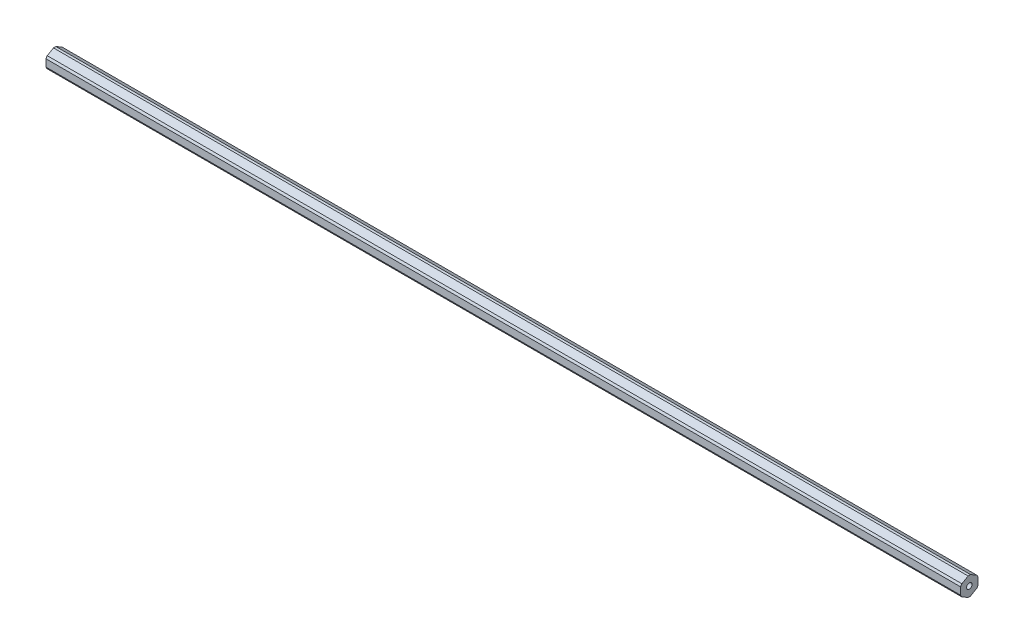
ISO-10303-21;
HEADER;
FILE_DESCRIPTION(('STEP AP214'),'2;1');
FILE_NAME('part.step','',(''),(''),'','','');
FILE_SCHEMA(('AUTOMOTIVE_DESIGN { 1 0 10303 214 1 1 1 1 }'));
ENDSEC;
DATA;
#1=APPLICATION_CONTEXT('core data for automotive mechanical design processes');
#2=APPLICATION_PROTOCOL_DEFINITION('international standard','automotive_design',2000,#1);
#3=PRODUCT_CONTEXT('',#1,'mechanical');
#4=PRODUCT('Part','Part','',(#3));
#5=PRODUCT_RELATED_PRODUCT_CATEGORY('part','',(#4));
#6=PRODUCT_DEFINITION_FORMATION('','',#4);
#7=PRODUCT_DEFINITION_CONTEXT('part definition',#1,'design');
#8=PRODUCT_DEFINITION('design','',#6,#7);
#9=PRODUCT_DEFINITION_SHAPE('','',#8);
#10=(LENGTH_UNIT() NAMED_UNIT(*) SI_UNIT(.MILLI.,.METRE.));
#11=(NAMED_UNIT(*) PLANE_ANGLE_UNIT() SI_UNIT($,.RADIAN.));
#12=(NAMED_UNIT(*) SI_UNIT($,.STERADIAN.) SOLID_ANGLE_UNIT());
#13=UNCERTAINTY_MEASURE_WITH_UNIT(LENGTH_MEASURE(1.E-05),#10,'distance_accuracy_value','');
#14=(GEOMETRIC_REPRESENTATION_CONTEXT(3) GLOBAL_UNCERTAINTY_ASSIGNED_CONTEXT((#13)) GLOBAL_UNIT_ASSIGNED_CONTEXT((#10,
#11,#12)) REPRESENTATION_CONTEXT('',''));
#15=CARTESIAN_POINT('',(0.,0.,0.));
#16=DIRECTION('',(0.,0.,1.));
#17=DIRECTION('',(1.,0.,0.));
#18=AXIS2_PLACEMENT_3D('',#15,#16,#17);
#19=CARTESIAN_POINT('',(328.6125,284.899735,498.475273482724));
#20=DIRECTION('',(0.,-0.866025403784436,-0.5));
#21=DIRECTION('',(0.,0.5,-0.866025403784436));
#22=AXIS2_PLACEMENT_3D('',#19,#20,#21);
#23=PLANE('',#22);
#24=DIRECTION('',(-1.,0.,0.));
#25=VECTOR('',#24,1.);
#26=CARTESIAN_POINT('',(328.6125,286.216566257194,496.194454840268));
#27=LINE('',#26,#25);
#28=CARTESIAN_POINT('',(328.6125,286.216566257194,496.194454840268));
#29=VERTEX_POINT('',#28);
#30=CARTESIAN_POINT('',(-341.3125,286.216566257194,496.194454840268));
#31=VERTEX_POINT('',#30);
#32=EDGE_CURVE('E182',#29,#31,#27,.T.);
#33=ORIENTED_EDGE('',*,*,#32,.T.);
#34=DIRECTION('',(0.,0.5,-0.866025403784436));
#35=VECTOR('',#34,1.);
#36=CARTESIAN_POINT('',(-341.3125,284.899735,498.475273482724));
#37=LINE('',#36,#35);
#38=CARTESIAN_POINT('',(-341.3125,283.582903742805,500.75609212518));
#39=VERTEX_POINT('',#38);
#40=EDGE_CURVE('E143',#39,#31,#37,.T.);
#41=ORIENTED_EDGE('',*,*,#40,.F.);
#42=DIRECTION('',(-1.,0.,0.));
#43=VECTOR('',#42,1.);
#44=CARTESIAN_POINT('',(328.6125,283.582903742805,500.75609212518));
#45=LINE('',#44,#43);
#46=CARTESIAN_POINT('',(328.6125,283.582903742805,500.75609212518));
#47=VERTEX_POINT('',#46);
#48=EDGE_CURVE('E185',#39,#47,#45,.F.);
#49=ORIENTED_EDGE('',*,*,#48,.T.);
#50=DIRECTION('',(0.,-0.5,0.866025403784436));
#51=VECTOR('',#50,1.);
#52=CARTESIAN_POINT('',(328.6125,284.899735,498.475273482724));
#53=LINE('',#52,#51);
#54=EDGE_CURVE('E193',#29,#47,#53,.T.);
#55=ORIENTED_EDGE('',*,*,#54,.F.);
#56=EDGE_LOOP('',(#33,#41,#49,#55));
#57=FACE_BOUND('',#56,.T.);
#58=ADVANCED_FACE('F17',(#57),#23,.F.);
#59=CARTESIAN_POINT('',(328.6125,279.4,501.650546965445));
#60=DIRECTION('',(0.,0.,-1.));
#61=DIRECTION('',(-1.,0.,0.));
#62=AXIS2_PLACEMENT_3D('',#59,#60,#61);
#63=PLANE('',#62);
#64=DIRECTION('',(-1.,0.,0.));
#65=VECTOR('',#64,1.);
#66=CARTESIAN_POINT('',(328.6125,282.03366251439,501.650546965445));
#67=LINE('',#66,#65);
#68=CARTESIAN_POINT('',(328.6125,282.03366251439,501.650546965445));
#69=VERTEX_POINT('',#68);
#70=CARTESIAN_POINT('',(-341.3125,282.03366251439,501.650546965445));
#71=VERTEX_POINT('',#70);
#72=EDGE_CURVE('E118',#69,#71,#67,.T.);
#73=ORIENTED_EDGE('',*,*,#72,.T.);
#74=DIRECTION('',(0.,1.,0.));
#75=VECTOR('',#74,1.);
#76=CARTESIAN_POINT('',(-341.3125,279.4,501.650546965445));
#77=LINE('',#76,#75);
#78=CARTESIAN_POINT('',(-341.3125,276.76633748561,501.650546965445));
#79=VERTEX_POINT('',#78);
#80=EDGE_CURVE('E136',#79,#71,#77,.T.);
#81=ORIENTED_EDGE('',*,*,#80,.F.);
#82=DIRECTION('',(-1.,0.,0.));
#83=VECTOR('',#82,1.);
#84=CARTESIAN_POINT('',(328.6125,276.76633748561,501.650546965445));
#85=LINE('',#84,#83);
#86=CARTESIAN_POINT('',(328.6125,276.76633748561,501.650546965445));
#87=VERTEX_POINT('',#86);
#88=EDGE_CURVE('E178',#79,#87,#85,.F.);
#89=ORIENTED_EDGE('',*,*,#88,.T.);
#90=DIRECTION('',(0.,-1.,0.));
#91=VECTOR('',#90,1.);
#92=CARTESIAN_POINT('',(328.6125,279.4,501.650546965445));
#93=LINE('',#92,#91);
#94=EDGE_CURVE('E197',#69,#87,#93,.T.);
#95=ORIENTED_EDGE('',*,*,#94,.F.);
#96=EDGE_LOOP('',(#73,#81,#89,#95));
#97=FACE_BOUND('',#96,.T.);
#98=ADVANCED_FACE('F257',(#97),#63,.F.);
#99=CARTESIAN_POINT('',(328.6125,273.900265,498.475273482724));
#100=DIRECTION('',(0.,0.86602540378444,-0.5));
#101=DIRECTION('',(0.,0.5,0.86602540378444));
#102=AXIS2_PLACEMENT_3D('',#99,#100,#101);
#103=PLANE('',#102);
#104=DIRECTION('',(-1.,0.,0.));
#105=VECTOR('',#104,1.);
#106=CARTESIAN_POINT('',(328.6125,275.217096257194,500.75609212518));
#107=LINE('',#106,#105);
#108=CARTESIAN_POINT('',(328.6125,275.217096257194,500.75609212518));
#109=VERTEX_POINT('',#108);
#110=CARTESIAN_POINT('',(-341.3125,275.217096257194,500.75609212518));
#111=VERTEX_POINT('',#110);
#112=EDGE_CURVE('E119',#109,#111,#107,.T.);
#113=ORIENTED_EDGE('',*,*,#112,.T.);
#114=DIRECTION('',(0.,0.5,0.86602540378444));
#115=VECTOR('',#114,1.);
#116=CARTESIAN_POINT('',(-341.3125,273.900265,498.475273482724));
#117=LINE('',#116,#115);
#118=CARTESIAN_POINT('',(-341.3125,272.583433742805,496.194454840267));
#119=VERTEX_POINT('',#118);
#120=EDGE_CURVE('E125',#119,#111,#117,.T.);
#121=ORIENTED_EDGE('',*,*,#120,.F.);
#122=DIRECTION('',(-1.,0.,0.));
#123=VECTOR('',#122,1.);
#124=CARTESIAN_POINT('',(328.6125,272.583433742805,496.194454840267));
#125=LINE('',#124,#123);
#126=CARTESIAN_POINT('',(328.6125,272.583433742805,496.194454840267));
#127=VERTEX_POINT('',#126);
#128=EDGE_CURVE('E106',#119,#127,#125,.F.);
#129=ORIENTED_EDGE('',*,*,#128,.T.);
#130=DIRECTION('',(0.,-0.5,-0.86602540378444));
#131=VECTOR('',#130,1.);
#132=CARTESIAN_POINT('',(328.6125,273.900265,498.475273482724));
#133=LINE('',#132,#131);
#134=EDGE_CURVE('E201',#109,#127,#133,.T.);
#135=ORIENTED_EDGE('',*,*,#134,.F.);
#136=EDGE_LOOP('',(#113,#121,#129,#135));
#137=FACE_BOUND('',#136,.T.);
#138=ADVANCED_FACE('F133',(#137),#103,.F.);
#139=CARTESIAN_POINT('',(328.6125,273.900265,492.12472651728));
#140=DIRECTION('',(0.,0.866025403784438,0.5));
#141=DIRECTION('',(0.,-0.5,0.866025403784438));
#142=AXIS2_PLACEMENT_3D('',#139,#140,#141);
#143=PLANE('',#142);
#144=DIRECTION('',(-1.,0.,0.));
#145=VECTOR('',#144,1.);
#146=CARTESIAN_POINT('',(328.6125,272.583433742805,494.405545159736));
#147=LINE('',#146,#145);
#148=CARTESIAN_POINT('',(328.6125,272.583433742805,494.405545159736));
#149=VERTEX_POINT('',#148);
#150=CARTESIAN_POINT('',(-341.3125,272.583433742805,494.405545159736));
#151=VERTEX_POINT('',#150);
#152=EDGE_CURVE('E169',#149,#151,#147,.T.);
#153=ORIENTED_EDGE('',*,*,#152,.T.);
#154=DIRECTION('',(0.,-0.5,0.866025403784438));
#155=VECTOR('',#154,1.);
#156=CARTESIAN_POINT('',(-341.3125,273.900265,492.12472651728));
#157=LINE('',#156,#155);
#158=CARTESIAN_POINT('',(-341.3125,275.217096257194,489.843907874824));
#159=VERTEX_POINT('',#158);
#160=EDGE_CURVE('E128',#159,#151,#157,.T.);
#161=ORIENTED_EDGE('',*,*,#160,.F.);
#162=DIRECTION('',(-1.,0.,0.));
#163=VECTOR('',#162,1.);
#164=CARTESIAN_POINT('',(328.6125,275.217096257194,489.843907874824));
#165=LINE('',#164,#163);
#166=CARTESIAN_POINT('',(328.6125,275.217096257194,489.843907874824));
#167=VERTEX_POINT('',#166);
#168=EDGE_CURVE('E171',#159,#167,#165,.F.);
#169=ORIENTED_EDGE('',*,*,#168,.T.);
#170=DIRECTION('',(0.,0.5,-0.866025403784438));
#171=VECTOR('',#170,1.);
#172=CARTESIAN_POINT('',(328.6125,273.900265,492.12472651728));
#173=LINE('',#172,#171);
#174=EDGE_CURVE('E204',#149,#167,#173,.T.);
#175=ORIENTED_EDGE('',*,*,#174,.F.);
#176=EDGE_LOOP('',(#153,#161,#169,#175));
#177=FACE_BOUND('',#176,.T.);
#178=ADVANCED_FACE('F287',(#177),#143,.F.);
#179=CARTESIAN_POINT('',(328.6125,279.4,488.949453034559));
#180=DIRECTION('',(0.,0.,1.));
#181=DIRECTION('',(1.,0.,0.));
#182=AXIS2_PLACEMENT_3D('',#179,#180,#181);
#183=PLANE('',#182);
#184=DIRECTION('',(-1.,0.,0.));
#185=VECTOR('',#184,1.);
#186=CARTESIAN_POINT('',(328.6125,276.76633748561,488.949453034559));
#187=LINE('',#186,#185);
#188=CARTESIAN_POINT('',(328.6125,276.76633748561,488.949453034559));
#189=VERTEX_POINT('',#188);
#190=CARTESIAN_POINT('',(-341.3125,276.76633748561,488.949453034559));
#191=VERTEX_POINT('',#190);
#192=EDGE_CURVE('E162',#189,#191,#187,.T.);
#193=ORIENTED_EDGE('',*,*,#192,.T.);
#194=DIRECTION('',(0.,-1.,0.));
#195=VECTOR('',#194,1.);
#196=CARTESIAN_POINT('',(-341.3125,279.4,488.949453034559));
#197=LINE('',#196,#195);
#198=CARTESIAN_POINT('',(-341.3125,282.03366251439,488.949453034559));
#199=VERTEX_POINT('',#198);
#200=EDGE_CURVE('E146',#199,#191,#197,.T.);
#201=ORIENTED_EDGE('',*,*,#200,.F.);
#202=DIRECTION('',(-1.,0.,0.));
#203=VECTOR('',#202,1.);
#204=CARTESIAN_POINT('',(328.6125,282.033662514389,488.949453034559));
#205=LINE('',#204,#203);
#206=CARTESIAN_POINT('',(328.6125,282.033662514389,488.949453034559));
#207=VERTEX_POINT('',#206);
#208=EDGE_CURVE('E165',#199,#207,#205,.F.);
#209=ORIENTED_EDGE('',*,*,#208,.T.);
#210=DIRECTION('',(0.,1.,0.));
#211=VECTOR('',#210,1.);
#212=CARTESIAN_POINT('',(328.6125,279.4,488.949453034559));
#213=LINE('',#212,#211);
#214=EDGE_CURVE('E25',#189,#207,#213,.T.);
#215=ORIENTED_EDGE('',*,*,#214,.F.);
#216=EDGE_LOOP('',(#193,#201,#209,#215));
#217=FACE_BOUND('',#216,.T.);
#218=ADVANCED_FACE('F217',(#217),#183,.F.);
#219=CARTESIAN_POINT('',(328.6125,284.899735,492.12472651728));
#220=DIRECTION('',(0.,-0.866025403784438,0.5));
#221=DIRECTION('',(0.,-0.5,-0.866025403784438));
#222=AXIS2_PLACEMENT_3D('',#219,#220,#221);
#223=PLANE('',#222);
#224=DIRECTION('',(-1.,0.,0.));
#225=VECTOR('',#224,1.);
#226=CARTESIAN_POINT('',(328.6125,283.582903742805,489.843907874824));
#227=LINE('',#226,#225);
#228=CARTESIAN_POINT('',(328.6125,283.582903742805,489.843907874824));
#229=VERTEX_POINT('',#228);
#230=CARTESIAN_POINT('',(-341.3125,283.582903742805,489.843907874824));
#231=VERTEX_POINT('',#230);
#232=EDGE_CURVE('E40',#229,#231,#227,.T.);
#233=ORIENTED_EDGE('',*,*,#232,.T.);
#234=DIRECTION('',(0.,-0.5,-0.866025403784438));
#235=VECTOR('',#234,1.);
#236=CARTESIAN_POINT('',(-341.3125,284.899735,492.12472651728));
#237=LINE('',#236,#235);
#238=CARTESIAN_POINT('',(-341.3125,286.216566257194,494.405545159736));
#239=VERTEX_POINT('',#238);
#240=EDGE_CURVE('E227',#239,#231,#237,.T.);
#241=ORIENTED_EDGE('',*,*,#240,.F.);
#242=DIRECTION('',(-1.,0.,0.));
#243=VECTOR('',#242,1.);
#244=CARTESIAN_POINT('',(328.6125,286.216566257194,494.405545159736));
#245=LINE('',#244,#243);
#246=CARTESIAN_POINT('',(328.6125,286.216566257194,494.405545159736));
#247=VERTEX_POINT('',#246);
#248=EDGE_CURVE('E159',#239,#247,#245,.F.);
#249=ORIENTED_EDGE('',*,*,#248,.T.);
#250=DIRECTION('',(0.,0.5,0.866025403784438));
#251=VECTOR('',#250,1.);
#252=CARTESIAN_POINT('',(328.6125,284.899735,492.12472651728));
#253=LINE('',#252,#251);
#254=EDGE_CURVE('E11',#229,#247,#253,.T.);
#255=ORIENTED_EDGE('',*,*,#254,.F.);
#256=EDGE_LOOP('',(#233,#241,#249,#255));
#257=FACE_BOUND('',#256,.T.);
#258=ADVANCED_FACE('F267',(#257),#223,.F.);
#259=CARTESIAN_POINT('',(328.6125,279.4,495.3));
#260=DIRECTION('',(1.,0.,0.));
#261=DIRECTION('',(0.,1.,0.));
#262=AXIS2_PLACEMENT_3D('',#259,#260,#261);
#263=PLANE('',#262);
#264=CARTESIAN_POINT('',(328.6125,279.4,495.3));
#265=DIRECTION('',(1.,0.,0.));
#266=DIRECTION('',(0.,1.,0.));
#267=AXIS2_PLACEMENT_3D('',#264,#265,#266);
#268=CIRCLE('',#267,2.);
#269=CARTESIAN_POINT('',(328.6125,281.4,495.3));
#270=VERTEX_POINT('',#269);
#271=EDGE_CURVE('E189',#270,#270,#268,.T.);
#272=ORIENTED_EDGE('',*,*,#271,.F.);
#273=EDGE_LOOP('',(#272));
#274=FACE_BOUND('',#273,.T.);
#275=ORIENTED_EDGE('',*,*,#54,.T.);
#276=CARTESIAN_POINT('',(328.6125,279.4,495.3));
#277=DIRECTION('',(1.,0.,0.));
#278=DIRECTION('',(0.,1.,0.));
#279=AXIS2_PLACEMENT_3D('',#276,#277,#278);
#280=CIRCLE('',#279,6.875);
#281=EDGE_CURVE('E156',#47,#69,#280,.T.);
#282=ORIENTED_EDGE('',*,*,#281,.T.);
#283=ORIENTED_EDGE('',*,*,#94,.T.);
#284=EDGE_CURVE('E245',#87,#109,#280,.T.);
#285=ORIENTED_EDGE('',*,*,#284,.T.);
#286=ORIENTED_EDGE('',*,*,#134,.T.);
#287=EDGE_CURVE('E112',#127,#149,#280,.T.);
#288=ORIENTED_EDGE('',*,*,#287,.T.);
#289=ORIENTED_EDGE('',*,*,#174,.T.);
#290=EDGE_CURVE('E215',#167,#189,#280,.T.);
#291=ORIENTED_EDGE('',*,*,#290,.T.);
#292=ORIENTED_EDGE('',*,*,#214,.T.);
#293=EDGE_CURVE('E155',#207,#229,#280,.T.);
#294=ORIENTED_EDGE('',*,*,#293,.T.);
#295=ORIENTED_EDGE('',*,*,#254,.T.);
#296=EDGE_CURVE('E32',#247,#29,#280,.T.);
#297=ORIENTED_EDGE('',*,*,#296,.T.);
#298=EDGE_LOOP('',(#275,#282,#283,#285,#286,#288,#289,#291,#292,#294,#295,#297));
#299=FACE_BOUND('',#298,.T.);
#300=ADVANCED_FACE('F213',(#274,#299),#263,.T.);
#301=CARTESIAN_POINT('',(328.6125,279.4,495.3));
#302=DIRECTION('',(-1.,0.,0.));
#303=DIRECTION('',(0.,-1.,0.));
#304=AXIS2_PLACEMENT_3D('',#301,#302,#303);
#305=CYLINDRICAL_SURFACE('',#304,2.);
#306=ORIENTED_EDGE('',*,*,#271,.T.);
#307=EDGE_LOOP('',(#306));
#308=FACE_BOUND('',#307,.T.);
#309=CARTESIAN_POINT('',(-341.3125,279.4,495.3));
#310=DIRECTION('',(-1.,0.,0.));
#311=DIRECTION('',(0.,-1.,0.));
#312=AXIS2_PLACEMENT_3D('',#309,#310,#311);
#313=CIRCLE('',#312,2.);
#314=CARTESIAN_POINT('',(-341.3125,277.4,495.3));
#315=VERTEX_POINT('',#314);
#316=EDGE_CURVE('E233',#315,#315,#313,.T.);
#317=ORIENTED_EDGE('',*,*,#316,.T.);
#318=EDGE_LOOP('',(#317));
#319=FACE_BOUND('',#318,.T.);
#320=ADVANCED_FACE('F281',(#308,#319),#305,.F.);
#321=CARTESIAN_POINT('',(328.6125,279.4,495.3));
#322=DIRECTION('',(-1.,0.,0.));
#323=DIRECTION('',(0.,-1.,0.));
#324=AXIS2_PLACEMENT_3D('',#321,#322,#323);
#325=CYLINDRICAL_SURFACE('',#324,6.875);
#326=ORIENTED_EDGE('',*,*,#208,.F.);
#327=CARTESIAN_POINT('',(-341.3125,279.4,495.3));
#328=DIRECTION('',(-1.,0.,0.));
#329=DIRECTION('',(0.,-1.,0.));
#330=AXIS2_PLACEMENT_3D('',#327,#328,#329);
#331=CIRCLE('',#330,6.875);
#332=EDGE_CURVE('E223',#231,#199,#331,.T.);
#333=ORIENTED_EDGE('',*,*,#332,.F.);
#334=ORIENTED_EDGE('',*,*,#232,.F.);
#335=ORIENTED_EDGE('',*,*,#293,.F.);
#336=EDGE_LOOP('',(#326,#333,#334,#335));
#337=FACE_BOUND('',#336,.T.);
#338=ADVANCED_FACE('F222',(#337),#325,.T.);
#339=ORIENTED_EDGE('',*,*,#296,.F.);
#340=ORIENTED_EDGE('',*,*,#248,.F.);
#341=EDGE_CURVE('E229',#31,#239,#331,.T.);
#342=ORIENTED_EDGE('',*,*,#341,.F.);
#343=ORIENTED_EDGE('',*,*,#32,.F.);
#344=EDGE_LOOP('',(#339,#340,#342,#343));
#345=FACE_BOUND('',#344,.T.);
#346=ADVANCED_FACE('F265',(#345),#325,.T.);
#347=ORIENTED_EDGE('',*,*,#168,.F.);
#348=EDGE_CURVE('E130',#191,#159,#331,.T.);
#349=ORIENTED_EDGE('',*,*,#348,.F.);
#350=ORIENTED_EDGE('',*,*,#192,.F.);
#351=ORIENTED_EDGE('',*,*,#290,.F.);
#352=EDGE_LOOP('',(#347,#349,#350,#351));
#353=FACE_BOUND('',#352,.T.);
#354=ADVANCED_FACE('F279',(#353),#325,.T.);
#355=ORIENTED_EDGE('',*,*,#128,.F.);
#356=EDGE_CURVE('E109',#151,#119,#331,.T.);
#357=ORIENTED_EDGE('',*,*,#356,.F.);
#358=ORIENTED_EDGE('',*,*,#152,.F.);
#359=ORIENTED_EDGE('',*,*,#287,.F.);
#360=EDGE_LOOP('',(#355,#357,#358,#359));
#361=FACE_BOUND('',#360,.T.);
#362=ADVANCED_FACE('F108',(#361),#325,.T.);
#363=ORIENTED_EDGE('',*,*,#88,.F.);
#364=EDGE_CURVE('E132',#111,#79,#331,.T.);
#365=ORIENTED_EDGE('',*,*,#364,.F.);
#366=ORIENTED_EDGE('',*,*,#112,.F.);
#367=ORIENTED_EDGE('',*,*,#284,.F.);
#368=EDGE_LOOP('',(#363,#365,#366,#367));
#369=FACE_BOUND('',#368,.T.);
#370=ADVANCED_FACE('F254',(#369),#325,.T.);
#371=ORIENTED_EDGE('',*,*,#48,.F.);
#372=EDGE_CURVE('E230',#71,#39,#331,.T.);
#373=ORIENTED_EDGE('',*,*,#372,.F.);
#374=ORIENTED_EDGE('',*,*,#72,.F.);
#375=ORIENTED_EDGE('',*,*,#281,.F.);
#376=EDGE_LOOP('',(#371,#373,#374,#375));
#377=FACE_BOUND('',#376,.T.);
#378=ADVANCED_FACE('F268',(#377),#325,.T.);
#379=CARTESIAN_POINT('',(-341.3125,279.4,495.3));
#380=DIRECTION('',(-1.,0.,0.));
#381=DIRECTION('',(0.,1.,0.));
#382=AXIS2_PLACEMENT_3D('',#379,#380,#381);
#383=PLANE('',#382);
#384=ORIENTED_EDGE('',*,*,#316,.F.);
#385=EDGE_LOOP('',(#384));
#386=FACE_BOUND('',#385,.T.);
#387=ORIENTED_EDGE('',*,*,#120,.T.);
#388=ORIENTED_EDGE('',*,*,#364,.T.);
#389=ORIENTED_EDGE('',*,*,#80,.T.);
#390=ORIENTED_EDGE('',*,*,#372,.T.);
#391=ORIENTED_EDGE('',*,*,#40,.T.);
#392=ORIENTED_EDGE('',*,*,#341,.T.);
#393=ORIENTED_EDGE('',*,*,#240,.T.);
#394=ORIENTED_EDGE('',*,*,#332,.T.);
#395=ORIENTED_EDGE('',*,*,#200,.T.);
#396=ORIENTED_EDGE('',*,*,#348,.T.);
#397=ORIENTED_EDGE('',*,*,#160,.T.);
#398=ORIENTED_EDGE('',*,*,#356,.T.);
#399=EDGE_LOOP('',(#387,#388,#389,#390,#391,#392,#393,#394,#395,#396,#397,#398));
#400=FACE_BOUND('',#399,.T.);
#401=ADVANCED_FACE('F123',(#386,#400),#383,.T.);
#402=CLOSED_SHELL('',(#58,#98,#138,#178,#218,#258,#300,#320,#338,#346,#354,#362,#370,#378,#401));
#403=MANIFOLD_SOLID_BREP('B1',#402);
#404=ADVANCED_BREP_SHAPE_REPRESENTATION('',(#18,#403),#14);
#405=SHAPE_DEFINITION_REPRESENTATION(#9,#404);
ENDSEC;
END-ISO-10303-21;
